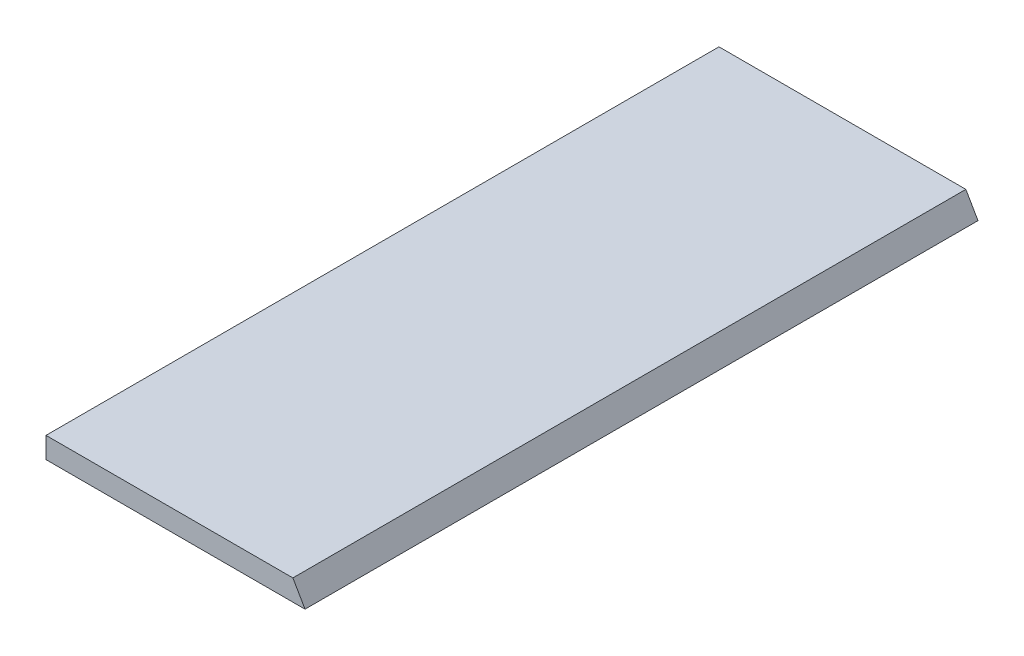
ISO-10303-21;
HEADER;
FILE_DESCRIPTION(('STEP AP214'),'2;1');
FILE_NAME('part.step','',(''),(''),'','','');
FILE_SCHEMA(('AUTOMOTIVE_DESIGN { 1 0 10303 214 1 1 1 1 }'));
ENDSEC;
DATA;
#1=APPLICATION_CONTEXT('core data for automotive mechanical design processes');
#2=APPLICATION_PROTOCOL_DEFINITION('international standard','automotive_design',2000,#1);
#3=PRODUCT_CONTEXT('',#1,'mechanical');
#4=PRODUCT('Part','Part','',(#3));
#5=PRODUCT_RELATED_PRODUCT_CATEGORY('part','',(#4));
#6=PRODUCT_DEFINITION_FORMATION('','',#4);
#7=PRODUCT_DEFINITION_CONTEXT('part definition',#1,'design');
#8=PRODUCT_DEFINITION('design','',#6,#7);
#9=PRODUCT_DEFINITION_SHAPE('','',#8);
#10=(LENGTH_UNIT() NAMED_UNIT(*) SI_UNIT(.MILLI.,.METRE.));
#11=(NAMED_UNIT(*) PLANE_ANGLE_UNIT() SI_UNIT($,.RADIAN.));
#12=(NAMED_UNIT(*) SI_UNIT($,.STERADIAN.) SOLID_ANGLE_UNIT());
#13=UNCERTAINTY_MEASURE_WITH_UNIT(LENGTH_MEASURE(1.E-05),#10,'distance_accuracy_value','');
#14=(GEOMETRIC_REPRESENTATION_CONTEXT(3) GLOBAL_UNCERTAINTY_ASSIGNED_CONTEXT((#13)) GLOBAL_UNIT_ASSIGNED_CONTEXT((#10,
#11,#12)) REPRESENTATION_CONTEXT('',''));
#15=CARTESIAN_POINT('',(0.,0.,0.));
#16=DIRECTION('',(0.,0.,1.));
#17=DIRECTION('',(1.,0.,0.));
#18=AXIS2_PLACEMENT_3D('',#15,#16,#17);
#19=CARTESIAN_POINT('',(-117.317574699332,19.05,-304.8));
#20=DIRECTION('',(0.,0.,1.));
#21=DIRECTION('',(1.,0.,0.));
#22=AXIS2_PLACEMENT_3D('',#19,#20,#21);
#23=PLANE('',#22);
#24=DIRECTION('',(-1.,0.,0.));
#25=VECTOR('',#24,1.);
#26=CARTESIAN_POINT('',(-117.317574699332,19.05,-304.8));
#27=LINE('',#26,#25);
#28=CARTESIAN_POINT('',(106.31905207127,19.05,-304.8));
#29=VERTEX_POINT('',#28);
#30=CARTESIAN_POINT('',(-117.317574699332,19.05,-304.8));
#31=VERTEX_POINT('',#30);
#32=EDGE_CURVE('E86',#29,#31,#27,.T.);
#33=ORIENTED_EDGE('',*,*,#32,.F.);
#34=DIRECTION('',(0.499999999999995,-0.866025403784441,0.));
#35=VECTOR('',#34,1.);
#36=CARTESIAN_POINT('',(117.317574699332,0.,-304.8));
#37=LINE('',#36,#35);
#38=CARTESIAN_POINT('',(117.317574699332,0.,-304.8));
#39=VERTEX_POINT('',#38);
#40=EDGE_CURVE('E80',#29,#39,#37,.T.);
#41=ORIENTED_EDGE('',*,*,#40,.T.);
#42=DIRECTION('',(-1.,0.,0.));
#43=VECTOR('',#42,1.);
#44=CARTESIAN_POINT('',(-117.317574699332,0.,-304.8));
#45=LINE('',#44,#43);
#46=CARTESIAN_POINT('',(-117.317574699332,0.,-304.8));
#47=VERTEX_POINT('',#46);
#48=EDGE_CURVE('E90',#39,#47,#45,.T.);
#49=ORIENTED_EDGE('',*,*,#48,.T.);
#50=DIRECTION('',(0.,-1.,0.));
#51=VECTOR('',#50,1.);
#52=CARTESIAN_POINT('',(-117.317574699332,19.05,-304.8));
#53=LINE('',#52,#51);
#54=EDGE_CURVE('E11',#31,#47,#53,.T.);
#55=ORIENTED_EDGE('',*,*,#54,.F.);
#56=EDGE_LOOP('',(#33,#41,#49,#55));
#57=FACE_BOUND('',#56,.T.);
#58=ADVANCED_FACE('F33',(#57),#23,.F.);
#59=CARTESIAN_POINT('',(-117.317574699332,19.05,304.8));
#60=DIRECTION('',(1.,0.,0.));
#61=DIRECTION('',(0.,0.,-1.));
#62=AXIS2_PLACEMENT_3D('',#59,#60,#61);
#63=PLANE('',#62);
#64=DIRECTION('',(0.,0.,1.));
#65=VECTOR('',#64,1.);
#66=CARTESIAN_POINT('',(-117.317574699332,0.,304.8));
#67=LINE('',#66,#65);
#68=CARTESIAN_POINT('',(-117.317574699332,0.,304.8));
#69=VERTEX_POINT('',#68);
#70=EDGE_CURVE('E61',#47,#69,#67,.T.);
#71=ORIENTED_EDGE('',*,*,#70,.T.);
#72=DIRECTION('',(0.,-1.,0.));
#73=VECTOR('',#72,1.);
#74=CARTESIAN_POINT('',(-117.317574699332,19.05,304.8));
#75=LINE('',#74,#73);
#76=CARTESIAN_POINT('',(-117.317574699332,19.05,304.8));
#77=VERTEX_POINT('',#76);
#78=EDGE_CURVE('E41',#77,#69,#75,.T.);
#79=ORIENTED_EDGE('',*,*,#78,.F.);
#80=DIRECTION('',(0.,0.,1.));
#81=VECTOR('',#80,1.);
#82=CARTESIAN_POINT('',(-117.317574699332,19.05,304.8));
#83=LINE('',#82,#81);
#84=EDGE_CURVE('E49',#31,#77,#83,.T.);
#85=ORIENTED_EDGE('',*,*,#84,.F.);
#86=ORIENTED_EDGE('',*,*,#54,.T.);
#87=EDGE_LOOP('',(#71,#79,#85,#86));
#88=FACE_BOUND('',#87,.T.);
#89=ADVANCED_FACE('F107',(#88),#63,.F.);
#90=CARTESIAN_POINT('',(-117.317574699332,19.05,304.8));
#91=DIRECTION('',(0.,0.,-1.));
#92=DIRECTION('',(-1.,0.,0.));
#93=AXIS2_PLACEMENT_3D('',#90,#91,#92);
#94=PLANE('',#93);
#95=DIRECTION('',(1.,0.,0.));
#96=VECTOR('',#95,1.);
#97=CARTESIAN_POINT('',(-117.317574699332,0.,304.8));
#98=LINE('',#97,#96);
#99=CARTESIAN_POINT('',(117.317574699332,0.,304.8));
#100=VERTEX_POINT('',#99);
#101=EDGE_CURVE('E83',#69,#100,#98,.T.);
#102=ORIENTED_EDGE('',*,*,#101,.T.);
#103=DIRECTION('',(0.499999999999995,-0.866025403784441,0.));
#104=VECTOR('',#103,1.);
#105=CARTESIAN_POINT('',(117.317574699332,0.,304.8));
#106=LINE('',#105,#104);
#107=CARTESIAN_POINT('',(106.31905207127,19.05,304.8));
#108=VERTEX_POINT('',#107);
#109=EDGE_CURVE('E68',#108,#100,#106,.T.);
#110=ORIENTED_EDGE('',*,*,#109,.F.);
#111=DIRECTION('',(1.,0.,0.));
#112=VECTOR('',#111,1.);
#113=CARTESIAN_POINT('',(-117.317574699332,19.05,304.8));
#114=LINE('',#113,#112);
#115=EDGE_CURVE('E95',#77,#108,#114,.T.);
#116=ORIENTED_EDGE('',*,*,#115,.F.);
#117=ORIENTED_EDGE('',*,*,#78,.T.);
#118=EDGE_LOOP('',(#102,#110,#116,#117));
#119=FACE_BOUND('',#118,.T.);
#120=ADVANCED_FACE('F84',(#119),#94,.F.);
#121=CARTESIAN_POINT('',(0.,19.05,0.));
#122=DIRECTION('',(0.,-1.,0.));
#123=DIRECTION('',(0.,0.,-1.));
#124=AXIS2_PLACEMENT_3D('',#121,#122,#123);
#125=PLANE('',#124);
#126=ORIENTED_EDGE('',*,*,#115,.T.);
#127=DIRECTION('',(0.,0.,1.));
#128=VECTOR('',#127,1.);
#129=CARTESIAN_POINT('',(106.31905207127,19.05,-304.8));
#130=LINE('',#129,#128);
#131=EDGE_CURVE('E77',#29,#108,#130,.T.);
#132=ORIENTED_EDGE('',*,*,#131,.F.);
#133=ORIENTED_EDGE('',*,*,#32,.T.);
#134=ORIENTED_EDGE('',*,*,#84,.T.);
#135=EDGE_LOOP('',(#126,#132,#133,#134));
#136=FACE_BOUND('',#135,.T.);
#137=ADVANCED_FACE('F106',(#136),#125,.F.);
#138=CARTESIAN_POINT('',(0.,0.,0.));
#139=DIRECTION('',(0.,-1.,0.));
#140=DIRECTION('',(0.,0.,-1.));
#141=AXIS2_PLACEMENT_3D('',#138,#139,#140);
#142=PLANE('',#141);
#143=DIRECTION('',(0.,0.,-1.));
#144=VECTOR('',#143,1.);
#145=CARTESIAN_POINT('',(117.317574699332,0.,304.8));
#146=LINE('',#145,#144);
#147=EDGE_CURVE('E73',#100,#39,#146,.T.);
#148=ORIENTED_EDGE('',*,*,#147,.F.);
#149=ORIENTED_EDGE('',*,*,#101,.F.);
#150=ORIENTED_EDGE('',*,*,#70,.F.);
#151=ORIENTED_EDGE('',*,*,#48,.F.);
#152=EDGE_LOOP('',(#148,#149,#150,#151));
#153=FACE_BOUND('',#152,.T.);
#154=ADVANCED_FACE('F89',(#153),#142,.T.);
#155=CARTESIAN_POINT('',(117.317574699332,0.,-304.8));
#156=DIRECTION('',(-0.866025403784442,-0.499999999999995,0.));
#157=DIRECTION('',(0.499999999999995,-0.866025403784442,0.));
#158=AXIS2_PLACEMENT_3D('',#155,#156,#157);
#159=PLANE('',#158);
#160=ORIENTED_EDGE('',*,*,#109,.T.);
#161=ORIENTED_EDGE('',*,*,#147,.T.);
#162=ORIENTED_EDGE('',*,*,#40,.F.);
#163=ORIENTED_EDGE('',*,*,#131,.T.);
#164=EDGE_LOOP('',(#160,#161,#162,#163));
#165=FACE_BOUND('',#164,.T.);
#166=ADVANCED_FACE('F70',(#165),#159,.F.);
#167=CLOSED_SHELL('',(#58,#89,#120,#137,#154,#166));
#168=MANIFOLD_SOLID_BREP('B2',#167);
#169=ADVANCED_BREP_SHAPE_REPRESENTATION('',(#18,#168),#14);
#170=SHAPE_DEFINITION_REPRESENTATION(#9,#169);
ENDSEC;
END-ISO-10303-21;
